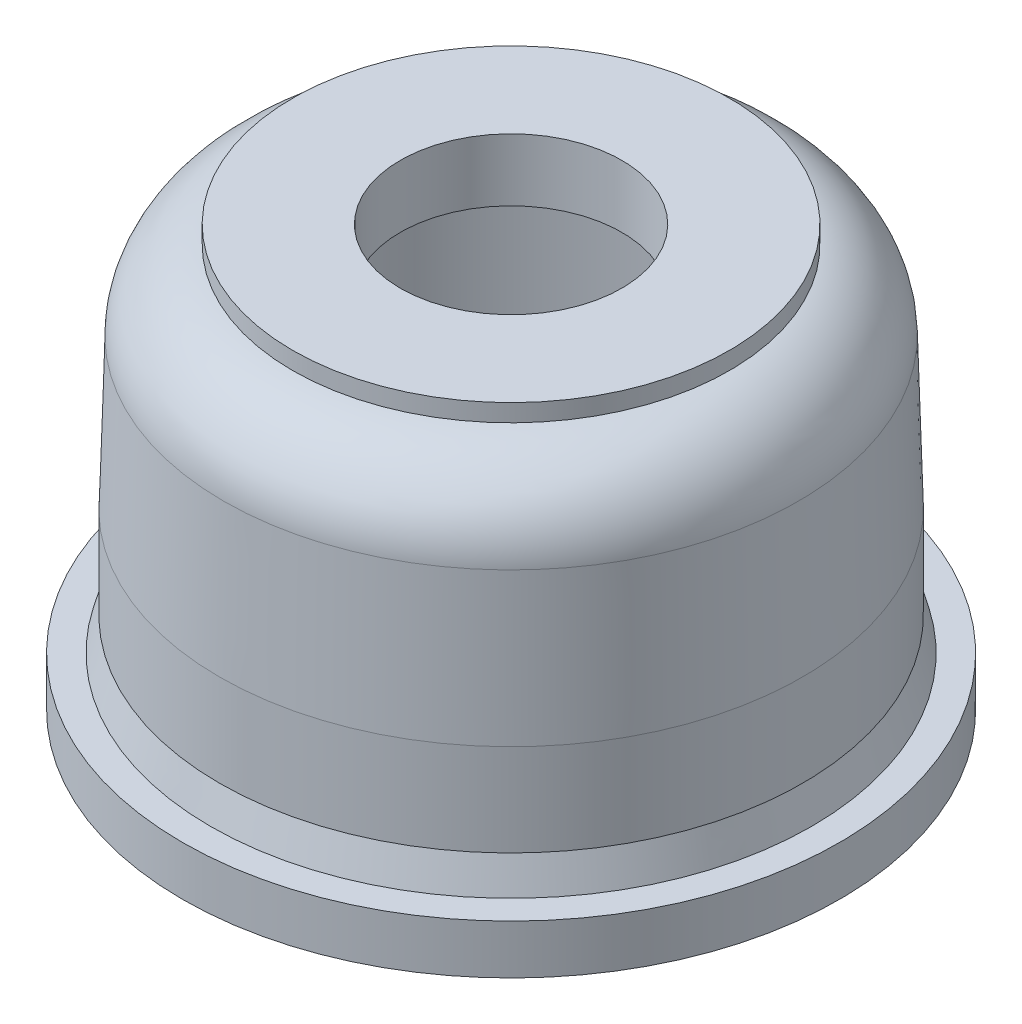
ISO-10303-21;
HEADER;
FILE_DESCRIPTION(('STEP AP214'),'2;1');
FILE_NAME('part.step','',(''),(''),'','','');
FILE_SCHEMA(('AUTOMOTIVE_DESIGN { 1 0 10303 214 1 1 1 1 }'));
ENDSEC;
DATA;
#1=APPLICATION_CONTEXT('core data for automotive mechanical design processes');
#2=APPLICATION_PROTOCOL_DEFINITION('international standard','automotive_design',2000,#1);
#3=PRODUCT_CONTEXT('',#1,'mechanical');
#4=PRODUCT('Part','Part','',(#3));
#5=PRODUCT_RELATED_PRODUCT_CATEGORY('part','',(#4));
#6=PRODUCT_DEFINITION_FORMATION('','',#4);
#7=PRODUCT_DEFINITION_CONTEXT('part definition',#1,'design');
#8=PRODUCT_DEFINITION('design','',#6,#7);
#9=PRODUCT_DEFINITION_SHAPE('','',#8);
#10=(LENGTH_UNIT() NAMED_UNIT(*) SI_UNIT(.MILLI.,.METRE.));
#11=(NAMED_UNIT(*) PLANE_ANGLE_UNIT() SI_UNIT($,.RADIAN.));
#12=(NAMED_UNIT(*) SI_UNIT($,.STERADIAN.) SOLID_ANGLE_UNIT());
#13=UNCERTAINTY_MEASURE_WITH_UNIT(LENGTH_MEASURE(1.E-05),#10,'distance_accuracy_value','');
#14=(GEOMETRIC_REPRESENTATION_CONTEXT(3) GLOBAL_UNCERTAINTY_ASSIGNED_CONTEXT((#13)) GLOBAL_UNIT_ASSIGNED_CONTEXT((#10,
#11,#12)) REPRESENTATION_CONTEXT('',''));
#15=CARTESIAN_POINT('',(0.,0.,0.));
#16=DIRECTION('',(0.,0.,1.));
#17=DIRECTION('',(1.,0.,0.));
#18=AXIS2_PLACEMENT_3D('',#15,#16,#17);
#19=CARTESIAN_POINT('',(6.63790648766688,0.,0.));
#20=DIRECTION('',(0.,-1.,0.));
#21=DIRECTION('',(0.,0.,-1.));
#22=AXIS2_PLACEMENT_3D('',#19,#20,#21);
#23=PLANE('',#22);
#24=CARTESIAN_POINT('',(0.,0.,0.));
#25=DIRECTION('',(0.,1.,0.));
#26=DIRECTION('',(0.,0.,1.));
#27=AXIS2_PLACEMENT_3D('',#24,#25,#26);
#28=CIRCLE('',#27,6.74);
#29=CARTESIAN_POINT('',(0.,0.,6.74));
#30=VERTEX_POINT('',#29);
#31=EDGE_CURVE('E108',#30,#30,#28,.T.);
#32=ORIENTED_EDGE('',*,*,#31,.F.);
#33=EDGE_LOOP('',(#32));
#34=FACE_BOUND('',#33,.T.);
#35=CARTESIAN_POINT('',(0.,0.,0.));
#36=DIRECTION('',(0.,1.,0.));
#37=DIRECTION('',(0.,0.,1.));
#38=AXIS2_PLACEMENT_3D('',#35,#36,#37);
#39=CIRCLE('',#38,13.2866999999696);
#40=CARTESIAN_POINT('',(0.,0.,13.2866999999696));
#41=VERTEX_POINT('',#40);
#42=EDGE_CURVE('E105',#41,#41,#39,.T.);
#43=ORIENTED_EDGE('',*,*,#42,.T.);
#44=EDGE_LOOP('',(#43));
#45=FACE_BOUND('',#44,.T.);
#46=ADVANCED_FACE('F32',(#34,#45),#23,.F.);
#47=CARTESIAN_POINT('',(0.,-3.79370421541481,0.));
#48=DIRECTION('',(0.,1.,0.));
#49=DIRECTION('',(0.,0.,1.));
#50=AXIS2_PLACEMENT_3D('',#47,#48,#49);
#51=PLANE('',#50);
#52=CARTESIAN_POINT('',(0.,-3.79370421541481,0.));
#53=DIRECTION('',(0.,1.,0.));
#54=DIRECTION('',(0.,0.,1.));
#55=AXIS2_PLACEMENT_3D('',#52,#53,#54);
#56=CIRCLE('',#55,6.74);
#57=CARTESIAN_POINT('',(0.,-3.79370421541481,6.74));
#58=VERTEX_POINT('',#57);
#59=EDGE_CURVE('E35',#58,#58,#56,.T.);
#60=ORIENTED_EDGE('',*,*,#59,.T.);
#61=EDGE_LOOP('',(#60));
#62=FACE_BOUND('',#61,.T.);
#63=CARTESIAN_POINT('',(0.,-3.79370421541481,0.));
#64=DIRECTION('',(0.,1.,0.));
#65=DIRECTION('',(0.,0.,1.));
#66=AXIS2_PLACEMENT_3D('',#63,#64,#65);
#67=CIRCLE('',#66,10.9889999999985);
#68=CARTESIAN_POINT('',(0.,-3.79370421541481,10.9889999999985));
#69=VERTEX_POINT('',#68);
#70=EDGE_CURVE('E10',#69,#69,#67,.T.);
#71=ORIENTED_EDGE('',*,*,#70,.F.);
#72=EDGE_LOOP('',(#71));
#73=FACE_BOUND('',#72,.T.);
#74=ADVANCED_FACE('F115',(#62,#73),#51,.F.);
#75=CARTESIAN_POINT('',(0.,-8.78870421541482,0.));
#76=DIRECTION('',(0.,1.,0.));
#77=DIRECTION('',(0.,0.,1.));
#78=AXIS2_PLACEMENT_3D('',#75,#76,#77);
#79=TOROIDAL_SURFACE('',#78,10.9890000000001,4.99499999999996);
#80=ORIENTED_EDGE('',*,*,#70,.T.);
#81=EDGE_LOOP('',(#80));
#82=FACE_BOUND('',#81,.T.);
#83=CARTESIAN_POINT('',(0.,-8.78870421541482,0.));
#84=DIRECTION('',(0.,1.,0.));
#85=DIRECTION('',(0.,0.,1.));
#86=AXIS2_PLACEMENT_3D('',#83,#84,#85);
#87=CIRCLE('',#86,15.9840000000001);
#88=CARTESIAN_POINT('',(0.,-8.78870421541482,15.9840000000001));
#89=VERTEX_POINT('',#88);
#90=EDGE_CURVE('E39',#89,#89,#87,.T.);
#91=ORIENTED_EDGE('',*,*,#90,.F.);
#92=EDGE_LOOP('',(#91));
#93=FACE_BOUND('',#92,.T.);
#94=ADVANCED_FACE('F133',(#82,#93),#79,.F.);
#95=CARTESIAN_POINT('',(0.,0.,0.));
#96=DIRECTION('',(0.,1.,0.));
#97=DIRECTION('',(0.,0.,1.));
#98=AXIS2_PLACEMENT_3D('',#95,#96,#97);
#99=CYLINDRICAL_SURFACE('',#98,15.984);
#100=CARTESIAN_POINT('',(0.,-20.2530687432037,0.));
#101=DIRECTION('',(0.,1.,0.));
#102=DIRECTION('',(0.,0.,1.));
#103=AXIS2_PLACEMENT_3D('',#100,#101,#102);
#104=CIRCLE('',#103,15.984);
#105=CARTESIAN_POINT('',(0.,-20.2530687432037,15.984));
#106=VERTEX_POINT('',#105);
#107=EDGE_CURVE('E43',#106,#106,#104,.T.);
#108=ORIENTED_EDGE('',*,*,#107,.F.);
#109=EDGE_LOOP('',(#108));
#110=FACE_BOUND('',#109,.T.);
#111=ORIENTED_EDGE('',*,*,#90,.T.);
#112=EDGE_LOOP('',(#111));
#113=FACE_BOUND('',#112,.T.);
#114=ADVANCED_FACE('F140',(#110,#113),#99,.F.);
#115=CARTESIAN_POINT('',(0.,-21.0813957845951,0.));
#116=DIRECTION('',(0.,1.,0.));
#117=DIRECTION('',(0.,0.,1.));
#118=AXIS2_PLACEMENT_3D('',#115,#116,#117);
#119=TOROIDAL_SURFACE('',#118,14.7352500000001,1.49849999999997);
#120=ORIENTED_EDGE('',*,*,#107,.T.);
#121=EDGE_LOOP('',(#120));
#122=FACE_BOUND('',#121,.T.);
#123=CARTESIAN_POINT('',(0.,-21.0813957845951,0.));
#124=DIRECTION('',(0.,1.,0.));
#125=DIRECTION('',(0.,0.,1.));
#126=AXIS2_PLACEMENT_3D('',#123,#124,#125);
#127=CIRCLE('',#126,16.23375);
#128=CARTESIAN_POINT('',(0.,-21.0813957845951,16.23375));
#129=VERTEX_POINT('',#128);
#130=EDGE_CURVE('E48',#129,#129,#127,.T.);
#131=ORIENTED_EDGE('',*,*,#130,.F.);
#132=EDGE_LOOP('',(#131));
#133=FACE_BOUND('',#132,.T.);
#134=ADVANCED_FACE('F145',(#122,#133),#119,.F.);
#135=CARTESIAN_POINT('',(0.,0.,0.));
#136=DIRECTION('',(0.,1.,0.));
#137=DIRECTION('',(0.,0.,1.));
#138=AXIS2_PLACEMENT_3D('',#135,#136,#137);
#139=CYLINDRICAL_SURFACE('',#138,16.23375);
#140=CARTESIAN_POINT('',(0.,-23.6956148805705,0.));
#141=DIRECTION('',(0.,1.,0.));
#142=DIRECTION('',(0.,0.,1.));
#143=AXIS2_PLACEMENT_3D('',#140,#141,#142);
#144=CIRCLE('',#143,16.23375);
#145=CARTESIAN_POINT('',(0.,-23.6956148805705,16.23375));
#146=VERTEX_POINT('',#145);
#147=EDGE_CURVE('E51',#146,#146,#144,.T.);
#148=ORIENTED_EDGE('',*,*,#147,.F.);
#149=EDGE_LOOP('',(#148));
#150=FACE_BOUND('',#149,.T.);
#151=ORIENTED_EDGE('',*,*,#130,.T.);
#152=EDGE_LOOP('',(#151));
#153=FACE_BOUND('',#152,.T.);
#154=ADVANCED_FACE('F149',(#150,#153),#139,.F.);
#155=CARTESIAN_POINT('',(0.,-24.8907198470286,0.));
#156=DIRECTION('',(0.,-1.,0.));
#157=DIRECTION('',(0.,0.,-1.));
#158=AXIS2_PLACEMENT_3D('',#155,#156,#157);
#159=CONICAL_SURFACE('',#158,18.7966608713049,1.13446401379633);
#160=ORIENTED_EDGE('',*,*,#147,.T.);
#161=EDGE_LOOP('',(#160));
#162=FACE_BOUND('',#161,.T.);
#163=CARTESIAN_POINT('',(0.,-24.8907198470286,0.));
#164=DIRECTION('',(0.,1.,0.));
#165=DIRECTION('',(0.,0.,1.));
#166=AXIS2_PLACEMENT_3D('',#163,#164,#165);
#167=CIRCLE('',#166,18.7966608713049);
#168=CARTESIAN_POINT('',(0.,-24.8907198470286,18.7966608713049));
#169=VERTEX_POINT('',#168);
#170=EDGE_CURVE('E54',#169,#169,#167,.T.);
#171=ORIENTED_EDGE('',*,*,#170,.F.);
#172=EDGE_LOOP('',(#171));
#173=FACE_BOUND('',#172,.T.);
#174=ADVANCED_FACE('F153',(#162,#173),#159,.F.);
#175=CARTESIAN_POINT('',(0.,-24.7096395511785,0.));
#176=DIRECTION('',(0.,1.,0.));
#177=DIRECTION('',(0.,0.,1.));
#178=AXIS2_PLACEMENT_3D('',#175,#176,#177);
#179=TOROIDAL_SURFACE('',#178,18.8811,0.199799999999962);
#180=CARTESIAN_POINT('',(0.,-24.7096395511785,0.));
#181=DIRECTION('',(0.,1.,0.));
#182=DIRECTION('',(0.,0.,1.));
#183=AXIS2_PLACEMENT_3D('',#180,#181,#182);
#184=CIRCLE('',#183,19.0809);
#185=CARTESIAN_POINT('',(0.,-24.7096395511785,19.0809));
#186=VERTEX_POINT('',#185);
#187=EDGE_CURVE('E57',#186,#186,#184,.T.);
#188=ORIENTED_EDGE('',*,*,#187,.F.);
#189=EDGE_LOOP('',(#188));
#190=FACE_BOUND('',#189,.T.);
#191=ORIENTED_EDGE('',*,*,#170,.T.);
#192=EDGE_LOOP('',(#191));
#193=FACE_BOUND('',#192,.T.);
#194=ADVANCED_FACE('F157',(#190,#193),#179,.T.);
#195=CARTESIAN_POINT('',(0.,0.,0.));
#196=DIRECTION('',(0.,1.,0.));
#197=DIRECTION('',(0.,0.,1.));
#198=AXIS2_PLACEMENT_3D('',#195,#196,#197);
#199=CYLINDRICAL_SURFACE('',#198,19.0809);
#200=ORIENTED_EDGE('',*,*,#187,.T.);
#201=EDGE_LOOP('',(#200));
#202=FACE_BOUND('',#201,.T.);
#203=CARTESIAN_POINT('',(0.,-22.9270500000038,0.));
#204=DIRECTION('',(0.,1.,0.));
#205=DIRECTION('',(0.,0.,1.));
#206=AXIS2_PLACEMENT_3D('',#203,#204,#205);
#207=CIRCLE('',#206,19.0809);
#208=CARTESIAN_POINT('',(0.,-22.9270500000038,19.0809));
#209=VERTEX_POINT('',#208);
#210=EDGE_CURVE('E60',#209,#209,#207,.T.);
#211=ORIENTED_EDGE('',*,*,#210,.F.);
#212=EDGE_LOOP('',(#211));
#213=FACE_BOUND('',#212,.T.);
#214=ADVANCED_FACE('F161',(#202,#213),#199,.T.);
#215=CARTESIAN_POINT('',(19.0809,-22.9270500000039,0.));
#216=DIRECTION('',(0.,1.,0.));
#217=DIRECTION('',(0.,0.,1.));
#218=AXIS2_PLACEMENT_3D('',#215,#216,#217);
#219=PLANE('',#218);
#220=CARTESIAN_POINT('',(0.,-22.9270500000039,0.));
#221=DIRECTION('',(0.,1.,0.));
#222=DIRECTION('',(0.,0.,1.));
#223=AXIS2_PLACEMENT_3D('',#220,#221,#222);
#224=CIRCLE('',#223,19.5804);
#225=CARTESIAN_POINT('',(0.,-22.9270500000039,19.5804));
#226=VERTEX_POINT('',#225);
#227=EDGE_CURVE('E63',#226,#226,#224,.T.);
#228=ORIENTED_EDGE('',*,*,#227,.F.);
#229=EDGE_LOOP('',(#228));
#230=FACE_BOUND('',#229,.T.);
#231=ORIENTED_EDGE('',*,*,#210,.T.);
#232=EDGE_LOOP('',(#231));
#233=FACE_BOUND('',#232,.T.);
#234=ADVANCED_FACE('F165',(#230,#233),#219,.F.);
#235=CARTESIAN_POINT('',(0.,0.,0.));
#236=DIRECTION('',(0.,1.,0.));
#237=DIRECTION('',(0.,0.,1.));
#238=AXIS2_PLACEMENT_3D('',#235,#236,#237);
#239=CYLINDRICAL_SURFACE('',#238,19.5804);
#240=CARTESIAN_POINT('',(0.,-25.074900000004,0.));
#241=DIRECTION('',(0.,1.,0.));
#242=DIRECTION('',(0.,0.,1.));
#243=AXIS2_PLACEMENT_3D('',#240,#241,#242);
#244=CIRCLE('',#243,19.5804);
#245=CARTESIAN_POINT('',(0.,-25.074900000004,19.5804));
#246=VERTEX_POINT('',#245);
#247=EDGE_CURVE('E66',#246,#246,#244,.T.);
#248=ORIENTED_EDGE('',*,*,#247,.F.);
#249=EDGE_LOOP('',(#248));
#250=FACE_BOUND('',#249,.T.);
#251=ORIENTED_EDGE('',*,*,#227,.T.);
#252=EDGE_LOOP('',(#251));
#253=FACE_BOUND('',#252,.T.);
#254=ADVANCED_FACE('F169',(#250,#253),#239,.F.);
#255=CARTESIAN_POINT('',(0.,-25.0055818860062,0.));
#256=DIRECTION('',(0.,1.,0.));
#257=DIRECTION('',(0.,0.,1.));
#258=AXIS2_PLACEMENT_3D('',#255,#256,#257);
#259=TOROIDAL_SURFACE('',#258,19.0610912403428,0.523914677008479);
#260=ORIENTED_EDGE('',*,*,#247,.T.);
#261=EDGE_LOOP('',(#260));
#262=FACE_BOUND('',#261,.T.);
#263=CARTESIAN_POINT('',(0.,-25.4096594374211,0.));
#264=DIRECTION('',(0.,1.,0.));
#265=DIRECTION('',(0.,0.,1.));
#266=AXIS2_PLACEMENT_3D('',#263,#264,#265);
#267=CIRCLE('',#266,18.7276127234524);
#268=CARTESIAN_POINT('',(0.,-25.4096594374211,18.7276127234524));
#269=VERTEX_POINT('',#268);
#270=EDGE_CURVE('E69',#269,#269,#267,.T.);
#271=ORIENTED_EDGE('',*,*,#270,.F.);
#272=EDGE_LOOP('',(#271));
#273=FACE_BOUND('',#272,.T.);
#274=ADVANCED_FACE('F173',(#262,#273),#259,.F.);
#275=CARTESIAN_POINT('',(0.,-25.4096594374211,0.));
#276=DIRECTION('',(0.,-1.,0.));
#277=DIRECTION('',(0.,0.,-1.));
#278=AXIS2_PLACEMENT_3D('',#275,#276,#277);
#279=CONICAL_SURFACE('',#278,18.7276127234524,1.13446401379632);
#280=CARTESIAN_POINT('',(0.,-24.246752151088,0.));
#281=DIRECTION('',(0.,1.,0.));
#282=DIRECTION('',(0.,0.,1.));
#283=AXIS2_PLACEMENT_3D('',#280,#281,#282);
#284=CIRCLE('',#283,16.23375);
#285=CARTESIAN_POINT('',(0.,-24.246752151088,16.23375));
#286=VERTEX_POINT('',#285);
#287=EDGE_CURVE('E72',#286,#286,#284,.T.);
#288=ORIENTED_EDGE('',*,*,#287,.F.);
#289=EDGE_LOOP('',(#288));
#290=FACE_BOUND('',#289,.T.);
#291=ORIENTED_EDGE('',*,*,#270,.T.);
#292=EDGE_LOOP('',(#291));
#293=FACE_BOUND('',#292,.T.);
#294=ADVANCED_FACE('F177',(#290,#293),#279,.T.);
#295=CARTESIAN_POINT('',(0.,0.,0.));
#296=DIRECTION('',(0.,1.,0.));
#297=DIRECTION('',(0.,0.,1.));
#298=AXIS2_PLACEMENT_3D('',#295,#296,#297);
#299=CYLINDRICAL_SURFACE('',#298,16.23375);
#300=ORIENTED_EDGE('',*,*,#287,.T.);
#301=EDGE_LOOP('',(#300));
#302=FACE_BOUND('',#301,.T.);
#303=CARTESIAN_POINT('',(0.,-24.5778957845931,0.));
#304=DIRECTION('',(0.,1.,0.));
#305=DIRECTION('',(0.,0.,1.));
#306=AXIS2_PLACEMENT_3D('',#303,#304,#305);
#307=CIRCLE('',#306,16.23375);
#308=CARTESIAN_POINT('',(0.,-24.5778957845931,16.23375));
#309=VERTEX_POINT('',#308);
#310=EDGE_CURVE('E75',#309,#309,#307,.T.);
#311=ORIENTED_EDGE('',*,*,#310,.F.);
#312=EDGE_LOOP('',(#311));
#313=FACE_BOUND('',#312,.T.);
#314=ADVANCED_FACE('F181',(#302,#313),#299,.F.);
#315=CARTESIAN_POINT('',(0.,-24.5778957845931,0.));
#316=DIRECTION('',(0.,1.,0.));
#317=DIRECTION('',(0.,0.,1.));
#318=AXIS2_PLACEMENT_3D('',#315,#316,#317);
#319=TOROIDAL_SURFACE('',#318,17.2327500000001,0.999000000000041);
#320=CARTESIAN_POINT('',(0.,-25.5690603695007,0.));
#321=DIRECTION('',(0.,1.,0.));
#322=DIRECTION('',(0.,0.,1.));
#323=AXIS2_PLACEMENT_3D('',#320,#321,#322);
#324=CIRCLE('',#323,17.1078750000001);
#325=CARTESIAN_POINT('',(0.,-25.5690603695007,17.1078750000001));
#326=VERTEX_POINT('',#325);
#327=EDGE_CURVE('E78',#326,#326,#324,.T.);
#328=ORIENTED_EDGE('',*,*,#327,.F.);
#329=EDGE_LOOP('',(#328));
#330=FACE_BOUND('',#329,.T.);
#331=ORIENTED_EDGE('',*,*,#310,.T.);
#332=EDGE_LOOP('',(#331));
#333=FACE_BOUND('',#332,.T.);
#334=ADVANCED_FACE('F185',(#330,#333),#319,.T.);
#335=CARTESIAN_POINT('',(0.,-25.5744000000019,0.));
#336=DIRECTION('',(0.,-1.,0.));
#337=DIRECTION('',(0.,0.,-1.));
#338=AXIS2_PLACEMENT_3D('',#335,#336,#337);
#339=CONICAL_SURFACE('',#338,17.1447101087494,1.42683873232639);
#340=ORIENTED_EDGE('',*,*,#327,.T.);
#341=EDGE_LOOP('',(#340));
#342=FACE_BOUND('',#341,.T.);
#343=CARTESIAN_POINT('',(0.,-25.5744000000019,0.));
#344=DIRECTION('',(0.,1.,0.));
#345=DIRECTION('',(0.,0.,1.));
#346=AXIS2_PLACEMENT_3D('',#343,#344,#345);
#347=CIRCLE('',#346,17.1447101087494);
#348=CARTESIAN_POINT('',(0.,-25.5744000000019,17.1447101087494));
#349=VERTEX_POINT('',#348);
#350=EDGE_CURVE('E81',#349,#349,#347,.T.);
#351=ORIENTED_EDGE('',*,*,#350,.F.);
#352=EDGE_LOOP('',(#351));
#353=FACE_BOUND('',#352,.T.);
#354=ADVANCED_FACE('F189',(#342,#353),#339,.F.);
#355=CARTESIAN_POINT('',(19.9799999999994,-25.5744000000019,0.));
#356=DIRECTION('',(0.,-1.,0.));
#357=DIRECTION('',(0.,0.,-1.));
#358=AXIS2_PLACEMENT_3D('',#355,#356,#357);
#359=PLANE('',#358);
#360=ORIENTED_EDGE('',*,*,#350,.T.);
#361=EDGE_LOOP('',(#360));
#362=FACE_BOUND('',#361,.T.);
#363=CARTESIAN_POINT('',(0.,-25.5744000000019,0.));
#364=DIRECTION('',(0.,1.,0.));
#365=DIRECTION('',(0.,0.,1.));
#366=AXIS2_PLACEMENT_3D('',#363,#364,#365);
#367=CIRCLE('',#366,19.9799999999994);
#368=CARTESIAN_POINT('',(0.,-25.5744000000019,19.9799999999994));
#369=VERTEX_POINT('',#368);
#370=EDGE_CURVE('E84',#369,#369,#367,.T.);
#371=ORIENTED_EDGE('',*,*,#370,.F.);
#372=EDGE_LOOP('',(#371));
#373=FACE_BOUND('',#372,.T.);
#374=ADVANCED_FACE('F193',(#362,#373),#359,.T.);
#375=CARTESIAN_POINT('',(0.,0.,0.));
#376=DIRECTION('',(0.,1.,0.));
#377=DIRECTION('',(0.,0.,1.));
#378=AXIS2_PLACEMENT_3D('',#375,#376,#377);
#379=CYLINDRICAL_SURFACE('',#378,19.9799999999994);
#380=ORIENTED_EDGE('',*,*,#370,.T.);
#381=EDGE_LOOP('',(#380));
#382=FACE_BOUND('',#381,.T.);
#383=CARTESIAN_POINT('',(0.,-22.5774000000022,0.));
#384=DIRECTION('',(0.,1.,0.));
#385=DIRECTION('',(0.,0.,1.));
#386=AXIS2_PLACEMENT_3D('',#383,#384,#385);
#387=CIRCLE('',#386,19.9799999999994);
#388=CARTESIAN_POINT('',(0.,-22.5774000000022,19.9799999999994));
#389=VERTEX_POINT('',#388);
#390=EDGE_CURVE('E87',#389,#389,#387,.T.);
#391=ORIENTED_EDGE('',*,*,#390,.F.);
#392=EDGE_LOOP('',(#391));
#393=FACE_BOUND('',#392,.T.);
#394=ADVANCED_FACE('F197',(#382,#393),#379,.T.);
#395=CARTESIAN_POINT('',(19.9799999999994,-22.5774000000022,0.));
#396=DIRECTION('',(0.,-1.,0.));
#397=DIRECTION('',(0.,0.,-1.));
#398=AXIS2_PLACEMENT_3D('',#395,#396,#397);
#399=PLANE('',#398);
#400=CARTESIAN_POINT('',(0.,-22.5774000000022,0.));
#401=DIRECTION('',(0.,1.,0.));
#402=DIRECTION('',(0.,0.,1.));
#403=AXIS2_PLACEMENT_3D('',#400,#401,#402);
#404=CIRCLE('',#403,18.2816999999982);
#405=CARTESIAN_POINT('',(0.,-22.5774000000022,18.2816999999982));
#406=VERTEX_POINT('',#405);
#407=EDGE_CURVE('E90',#406,#406,#404,.T.);
#408=ORIENTED_EDGE('',*,*,#407,.F.);
#409=EDGE_LOOP('',(#408));
#410=FACE_BOUND('',#409,.T.);
#411=ORIENTED_EDGE('',*,*,#390,.T.);
#412=EDGE_LOOP('',(#411));
#413=FACE_BOUND('',#412,.T.);
#414=ADVANCED_FACE('F201',(#410,#413),#399,.F.);
#415=CARTESIAN_POINT('',(0.,-22.5774000000022,0.));
#416=DIRECTION('',(0.,-1.,0.));
#417=DIRECTION('',(0.,0.,-1.));
#418=AXIS2_PLACEMENT_3D('',#415,#416,#417);
#419=CONICAL_SURFACE('',#418,18.2816999999982,0.268366210905934);
#420=CARTESIAN_POINT('',(0.,-20.5794000000023,0.));
#421=DIRECTION('',(0.,1.,0.));
#422=DIRECTION('',(0.,0.,1.));
#423=AXIS2_PLACEMENT_3D('',#420,#421,#422);
#424=CIRCLE('',#423,17.7322499999982);
#425=CARTESIAN_POINT('',(0.,-20.5794000000023,17.7322499999982));
#426=VERTEX_POINT('',#425);
#427=EDGE_CURVE('E93',#426,#426,#424,.T.);
#428=ORIENTED_EDGE('',*,*,#427,.F.);
#429=EDGE_LOOP('',(#428));
#430=FACE_BOUND('',#429,.T.);
#431=ORIENTED_EDGE('',*,*,#407,.T.);
#432=EDGE_LOOP('',(#431));
#433=FACE_BOUND('',#432,.T.);
#434=ADVANCED_FACE('F205',(#430,#433),#419,.T.);
#435=CARTESIAN_POINT('',(0.,0.,0.));
#436=DIRECTION('',(0.,1.,0.));
#437=DIRECTION('',(0.,0.,1.));
#438=AXIS2_PLACEMENT_3D('',#435,#436,#437);
#439=CYLINDRICAL_SURFACE('',#438,17.7322499999982);
#440=CARTESIAN_POINT('',(0.,-14.9825042154146,0.));
#441=DIRECTION('',(0.,1.,0.));
#442=DIRECTION('',(0.,0.,1.));
#443=AXIS2_PLACEMENT_3D('',#440,#441,#442);
#444=CIRCLE('',#443,17.7322499999982);
#445=CARTESIAN_POINT('',(0.,-14.9825042154146,17.7322499999982));
#446=VERTEX_POINT('',#445);
#447=EDGE_CURVE('E96',#446,#446,#444,.T.);
#448=ORIENTED_EDGE('',*,*,#447,.F.);
#449=EDGE_LOOP('',(#448));
#450=FACE_BOUND('',#449,.T.);
#451=ORIENTED_EDGE('',*,*,#427,.T.);
#452=EDGE_LOOP('',(#451));
#453=FACE_BOUND('',#452,.T.);
#454=ADVANCED_FACE('F209',(#450,#453),#439,.T.);
#455=CARTESIAN_POINT('',(0.,-14.9825042154146,0.));
#456=DIRECTION('',(0.,-1.,0.));
#457=DIRECTION('',(0.,0.,-1.));
#458=AXIS2_PLACEMENT_3D('',#455,#456,#457);
#459=CONICAL_SURFACE('',#458,17.7322499999982,0.0281760212949861);
#460=CARTESIAN_POINT('',(0.,-5.85327939476403,0.));
#461=DIRECTION('',(0.,1.,0.));
#462=DIRECTION('',(0.,0.,1.));
#463=AXIS2_PLACEMENT_3D('',#460,#461,#462);
#464=CIRCLE('',#463,17.4749566760651);
#465=CARTESIAN_POINT('',(0.,-5.85327939476403,17.4749566760651));
#466=VERTEX_POINT('',#465);
#467=EDGE_CURVE('E99',#466,#466,#464,.T.);
#468=ORIENTED_EDGE('',*,*,#467,.F.);
#469=EDGE_LOOP('',(#468));
#470=FACE_BOUND('',#469,.T.);
#471=ORIENTED_EDGE('',*,*,#447,.T.);
#472=EDGE_LOOP('',(#471));
#473=FACE_BOUND('',#472,.T.);
#474=ADVANCED_FACE('F213',(#470,#473),#459,.T.);
#475=CARTESIAN_POINT('',(0.,-5.9940000000037,0.));
#476=DIRECTION('',(0.,1.,0.));
#477=DIRECTION('',(0.,0.,1.));
#478=AXIS2_PLACEMENT_3D('',#475,#476,#477);
#479=TOROIDAL_SURFACE('',#478,12.4819392806156,4.99500000000001);
#480=CARTESIAN_POINT('',(0.,-1.06425505887494,0.));
#481=DIRECTION('',(0.,1.,0.));
#482=DIRECTION('',(0.,0.,1.));
#483=AXIS2_PLACEMENT_3D('',#480,#481,#482);
#484=CIRCLE('',#483,13.2866999999698);
#485=CARTESIAN_POINT('',(0.,-1.06425505887494,13.2866999999698));
#486=VERTEX_POINT('',#485);
#487=EDGE_CURVE('E102',#486,#486,#484,.T.);
#488=ORIENTED_EDGE('',*,*,#487,.F.);
#489=EDGE_LOOP('',(#488));
#490=FACE_BOUND('',#489,.T.);
#491=ORIENTED_EDGE('',*,*,#467,.T.);
#492=EDGE_LOOP('',(#491));
#493=FACE_BOUND('',#492,.T.);
#494=ADVANCED_FACE('F125',(#490,#493),#479,.T.);
#495=CARTESIAN_POINT('',(0.,0.,0.));
#496=DIRECTION('',(0.,1.,0.));
#497=DIRECTION('',(0.,0.,1.));
#498=AXIS2_PLACEMENT_3D('',#495,#496,#497);
#499=CYLINDRICAL_SURFACE('',#498,13.2866999999697);
#500=ORIENTED_EDGE('',*,*,#487,.T.);
#501=EDGE_LOOP('',(#500));
#502=FACE_BOUND('',#501,.T.);
#503=ORIENTED_EDGE('',*,*,#42,.F.);
#504=EDGE_LOOP('',(#503));
#505=FACE_BOUND('',#504,.T.);
#506=ADVANCED_FACE('F120',(#502,#505),#499,.T.);
#507=CARTESIAN_POINT('',(0.,-10.,0.));
#508=DIRECTION('',(0.,1.,0.));
#509=DIRECTION('',(0.,0.,1.));
#510=AXIS2_PLACEMENT_3D('',#507,#508,#509);
#511=CYLINDRICAL_SURFACE('',#510,6.74);
#512=ORIENTED_EDGE('',*,*,#31,.T.);
#513=EDGE_LOOP('',(#512));
#514=FACE_BOUND('',#513,.T.);
#515=ORIENTED_EDGE('',*,*,#59,.F.);
#516=EDGE_LOOP('',(#515));
#517=FACE_BOUND('',#516,.T.);
#518=ADVANCED_FACE('F118',(#514,#517),#511,.F.);
#519=CLOSED_SHELL('',(#46,#74,#94,#114,#134,#154,#174,#194,#214,#234,#254,#274,#294,#314,#334,
#354,#374,#394,#414,#434,#454,#474,#494,#506,#518));
#520=MANIFOLD_SOLID_BREP('B2',#519);
#521=ADVANCED_BREP_SHAPE_REPRESENTATION('',(#18,#520),#14);
#522=SHAPE_DEFINITION_REPRESENTATION(#9,#521);
ENDSEC;
END-ISO-10303-21;
